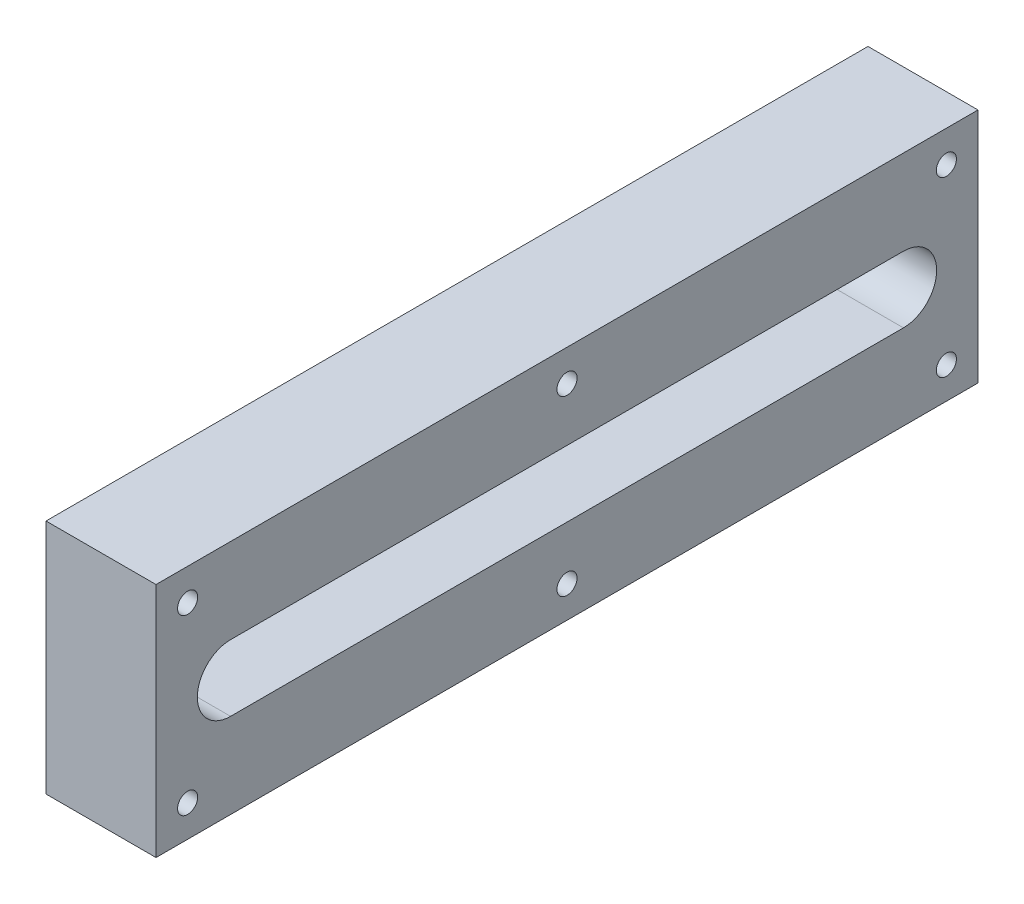
ISO-10303-21;
HEADER;
FILE_DESCRIPTION(('STEP AP214'),'2;1');
FILE_NAME('part.step','',(''),(''),'','','');
FILE_SCHEMA(('AUTOMOTIVE_DESIGN { 1 0 10303 214 1 1 1 1 }'));
ENDSEC;
DATA;
#1=APPLICATION_CONTEXT('core data for automotive mechanical design processes');
#2=APPLICATION_PROTOCOL_DEFINITION('international standard','automotive_design',2000,#1);
#3=PRODUCT_CONTEXT('',#1,'mechanical');
#4=PRODUCT('Part','Part','',(#3));
#5=PRODUCT_RELATED_PRODUCT_CATEGORY('part','',(#4));
#6=PRODUCT_DEFINITION_FORMATION('','',#4);
#7=PRODUCT_DEFINITION_CONTEXT('part definition',#1,'design');
#8=PRODUCT_DEFINITION('design','',#6,#7);
#9=PRODUCT_DEFINITION_SHAPE('','',#8);
#10=(LENGTH_UNIT() NAMED_UNIT(*) SI_UNIT(.MILLI.,.METRE.));
#11=(NAMED_UNIT(*) PLANE_ANGLE_UNIT() SI_UNIT($,.RADIAN.));
#12=(NAMED_UNIT(*) SI_UNIT($,.STERADIAN.) SOLID_ANGLE_UNIT());
#13=UNCERTAINTY_MEASURE_WITH_UNIT(LENGTH_MEASURE(1.E-05),#10,'distance_accuracy_value','');
#14=(GEOMETRIC_REPRESENTATION_CONTEXT(3) GLOBAL_UNCERTAINTY_ASSIGNED_CONTEXT((#13)) GLOBAL_UNIT_ASSIGNED_CONTEXT((#10,
#11,#12)) REPRESENTATION_CONTEXT('',''));
#15=CARTESIAN_POINT('',(0.,0.,0.));
#16=DIRECTION('',(0.,0.,1.));
#17=DIRECTION('',(1.,0.,0.));
#18=AXIS2_PLACEMENT_3D('',#15,#16,#17);
#19=CARTESIAN_POINT('',(22.098,0.,0.));
#20=DIRECTION('',(1.,0.,0.));
#21=DIRECTION('',(0.,0.,-1.));
#22=AXIS2_PLACEMENT_3D('',#19,#20,#21);
#23=PLANE('',#22);
#24=CARTESIAN_POINT('',(22.098,17.399,76.2));
#25=DIRECTION('',(1.,0.,0.));
#26=DIRECTION('',(0.,0.,-1.));
#27=AXIS2_PLACEMENT_3D('',#24,#25,#26);
#28=CIRCLE('',#27,2.0193);
#29=CARTESIAN_POINT('',(22.098,17.399,74.1807));
#30=VERTEX_POINT('',#29);
#31=EDGE_CURVE('E256',#30,#30,#28,.T.);
#32=ORIENTED_EDGE('',*,*,#31,.F.);
#33=EDGE_LOOP('',(#32));
#34=FACE_BOUND('',#33,.T.);
#35=CARTESIAN_POINT('',(22.098,-17.399,76.2));
#36=DIRECTION('',(1.,0.,0.));
#37=DIRECTION('',(0.,0.,-1.));
#38=AXIS2_PLACEMENT_3D('',#35,#36,#37);
#39=CIRCLE('',#38,2.0193);
#40=CARTESIAN_POINT('',(22.098,-17.399,74.1807));
#41=VERTEX_POINT('',#40);
#42=EDGE_CURVE('E258',#41,#41,#39,.T.);
#43=ORIENTED_EDGE('',*,*,#42,.F.);
#44=EDGE_LOOP('',(#43));
#45=FACE_BOUND('',#44,.T.);
#46=CARTESIAN_POINT('',(22.098,-17.399,0.));
#47=DIRECTION('',(1.,0.,0.));
#48=DIRECTION('',(0.,0.,-1.));
#49=AXIS2_PLACEMENT_3D('',#46,#47,#48);
#50=CIRCLE('',#49,2.0193);
#51=CARTESIAN_POINT('',(22.098,-17.399,-2.0193));
#52=VERTEX_POINT('',#51);
#53=EDGE_CURVE('E266',#52,#52,#50,.T.);
#54=ORIENTED_EDGE('',*,*,#53,.F.);
#55=EDGE_LOOP('',(#54));
#56=FACE_BOUND('',#55,.T.);
#57=CARTESIAN_POINT('',(22.098,-17.399,-76.2));
#58=DIRECTION('',(1.,0.,0.));
#59=DIRECTION('',(0.,0.,-1.));
#60=AXIS2_PLACEMENT_3D('',#57,#58,#59);
#61=CIRCLE('',#60,2.0193);
#62=CARTESIAN_POINT('',(22.098,-17.399,-78.2193));
#63=VERTEX_POINT('',#62);
#64=EDGE_CURVE('E272',#63,#63,#61,.T.);
#65=ORIENTED_EDGE('',*,*,#64,.F.);
#66=EDGE_LOOP('',(#65));
#67=FACE_BOUND('',#66,.T.);
#68=CARTESIAN_POINT('',(22.098,17.399,-76.2));
#69=DIRECTION('',(1.,0.,0.));
#70=DIRECTION('',(0.,0.,-1.));
#71=AXIS2_PLACEMENT_3D('',#68,#69,#70);
#72=CIRCLE('',#71,2.0193);
#73=CARTESIAN_POINT('',(22.098,17.399,-78.2193));
#74=VERTEX_POINT('',#73);
#75=EDGE_CURVE('E278',#74,#74,#72,.T.);
#76=ORIENTED_EDGE('',*,*,#75,.F.);
#77=EDGE_LOOP('',(#76));
#78=FACE_BOUND('',#77,.T.);
#79=CARTESIAN_POINT('',(22.098,17.399,0.));
#80=DIRECTION('',(1.,0.,0.));
#81=DIRECTION('',(0.,0.,-1.));
#82=AXIS2_PLACEMENT_3D('',#79,#80,#81);
#83=CIRCLE('',#82,2.0193);
#84=CARTESIAN_POINT('',(22.098,17.399,-2.0193));
#85=VERTEX_POINT('',#84);
#86=EDGE_CURVE('E284',#85,#85,#83,.T.);
#87=ORIENTED_EDGE('',*,*,#86,.F.);
#88=EDGE_LOOP('',(#87));
#89=FACE_BOUND('',#88,.T.);
#90=DIRECTION('',(0.,-1.,0.));
#91=VECTOR('',#90,1.);
#92=CARTESIAN_POINT('',(22.098,-23.749,82.55));
#93=LINE('',#92,#91);
#94=CARTESIAN_POINT('',(22.098,23.749,82.55));
#95=VERTEX_POINT('',#94);
#96=CARTESIAN_POINT('',(22.098,-23.749,82.55));
#97=VERTEX_POINT('',#96);
#98=EDGE_CURVE('E146',#95,#97,#93,.T.);
#99=ORIENTED_EDGE('',*,*,#98,.T.);
#100=DIRECTION('',(0.,0.,-1.));
#101=VECTOR('',#100,1.);
#102=CARTESIAN_POINT('',(22.098,-23.749,-82.55));
#103=LINE('',#102,#101);
#104=CARTESIAN_POINT('',(22.098,-23.749,-82.55));
#105=VERTEX_POINT('',#104);
#106=EDGE_CURVE('E149',#97,#105,#103,.T.);
#107=ORIENTED_EDGE('',*,*,#106,.T.);
#108=DIRECTION('',(0.,1.,0.));
#109=VECTOR('',#108,1.);
#110=CARTESIAN_POINT('',(22.098,-23.749,-82.55));
#111=LINE('',#110,#109);
#112=CARTESIAN_POINT('',(22.098,23.749,-82.55));
#113=VERTEX_POINT('',#112);
#114=EDGE_CURVE('E152',#105,#113,#111,.T.);
#115=ORIENTED_EDGE('',*,*,#114,.T.);
#116=DIRECTION('',(0.,0.,1.));
#117=VECTOR('',#116,1.);
#118=CARTESIAN_POINT('',(22.098,23.749,-82.55));
#119=LINE('',#118,#117);
#120=EDGE_CURVE('E154',#113,#95,#119,.T.);
#121=ORIENTED_EDGE('',*,*,#120,.T.);
#122=EDGE_LOOP('',(#99,#107,#115,#121));
#123=FACE_BOUND('',#122,.T.);
#124=DIRECTION('',(0.,0.,-1.));
#125=VECTOR('',#124,1.);
#126=CARTESIAN_POINT('',(22.098,-6.66750000000002,67.5752522));
#127=LINE('',#126,#125);
#128=CARTESIAN_POINT('',(22.098,-6.66750000000002,67.5752522));
#129=VERTEX_POINT('',#128);
#130=CARTESIAN_POINT('',(22.098,-6.6675,-67.5752522));
#131=VERTEX_POINT('',#130);
#132=EDGE_CURVE('E116',#129,#131,#127,.T.);
#133=ORIENTED_EDGE('',*,*,#132,.F.);
#134=CARTESIAN_POINT('',(22.098,0.,67.5752522));
#135=DIRECTION('',(1.,0.,0.));
#136=DIRECTION('',(0.,0.,-1.));
#137=AXIS2_PLACEMENT_3D('',#134,#135,#136);
#138=CIRCLE('',#137,6.66750000000002);
#139=CARTESIAN_POINT('',(22.098,6.66750000000002,67.5752522));
#140=VERTEX_POINT('',#139);
#141=EDGE_CURVE('E108',#140,#129,#138,.T.);
#142=ORIENTED_EDGE('',*,*,#141,.F.);
#143=DIRECTION('',(0.,0.,1.));
#144=VECTOR('',#143,1.);
#145=CARTESIAN_POINT('',(22.098,6.66750000000002,67.5752522));
#146=LINE('',#145,#144);
#147=CARTESIAN_POINT('',(22.098,6.66750000000005,-67.5752522));
#148=VERTEX_POINT('',#147);
#149=EDGE_CURVE('E130',#148,#140,#146,.T.);
#150=ORIENTED_EDGE('',*,*,#149,.F.);
#151=CARTESIAN_POINT('',(22.098,0.,-67.5752522));
#152=DIRECTION('',(1.,0.,0.));
#153=DIRECTION('',(0.,0.,-1.));
#154=AXIS2_PLACEMENT_3D('',#151,#152,#153);
#155=CIRCLE('',#154,6.66750000000002);
#156=EDGE_CURVE('E128',#131,#148,#155,.T.);
#157=ORIENTED_EDGE('',*,*,#156,.F.);
#158=EDGE_LOOP('',(#133,#142,#150,#157));
#159=FACE_BOUND('',#158,.T.);
#160=ADVANCED_FACE('F43',(#34,#45,#56,#67,#78,#89,#123,#159),#23,.T.);
#161=CARTESIAN_POINT('',(0.,0.,0.));
#162=DIRECTION('',(1.,0.,0.));
#163=DIRECTION('',(0.,0.,-1.));
#164=AXIS2_PLACEMENT_3D('',#161,#162,#163);
#165=PLANE('',#164);
#166=CARTESIAN_POINT('',(0.,17.399,76.2));
#167=DIRECTION('',(1.,0.,0.));
#168=DIRECTION('',(0.,0.,-1.));
#169=AXIS2_PLACEMENT_3D('',#166,#167,#168);
#170=CIRCLE('',#169,2.01929999999999);
#171=CARTESIAN_POINT('',(0.,17.399,74.1807));
#172=VERTEX_POINT('',#171);
#173=EDGE_CURVE('E254',#172,#172,#170,.T.);
#174=ORIENTED_EDGE('',*,*,#173,.T.);
#175=EDGE_LOOP('',(#174));
#176=FACE_BOUND('',#175,.T.);
#177=CARTESIAN_POINT('',(0.,-17.399,76.2));
#178=DIRECTION('',(1.,0.,0.));
#179=DIRECTION('',(0.,0.,-1.));
#180=AXIS2_PLACEMENT_3D('',#177,#178,#179);
#181=CIRCLE('',#180,2.01929999999999);
#182=CARTESIAN_POINT('',(0.,-17.399,74.1807));
#183=VERTEX_POINT('',#182);
#184=EDGE_CURVE('E263',#183,#183,#181,.T.);
#185=ORIENTED_EDGE('',*,*,#184,.T.);
#186=EDGE_LOOP('',(#185));
#187=FACE_BOUND('',#186,.T.);
#188=CARTESIAN_POINT('',(0.,-17.399,0.));
#189=DIRECTION('',(1.,0.,0.));
#190=DIRECTION('',(0.,0.,-1.));
#191=AXIS2_PLACEMENT_3D('',#188,#189,#190);
#192=CIRCLE('',#191,2.01929999999999);
#193=CARTESIAN_POINT('',(0.,-17.399,-2.01929999999999));
#194=VERTEX_POINT('',#193);
#195=EDGE_CURVE('E269',#194,#194,#192,.T.);
#196=ORIENTED_EDGE('',*,*,#195,.T.);
#197=EDGE_LOOP('',(#196));
#198=FACE_BOUND('',#197,.T.);
#199=CARTESIAN_POINT('',(0.,-17.399,-76.2));
#200=DIRECTION('',(1.,0.,0.));
#201=DIRECTION('',(0.,0.,-1.));
#202=AXIS2_PLACEMENT_3D('',#199,#200,#201);
#203=CIRCLE('',#202,2.01929999999999);
#204=CARTESIAN_POINT('',(0.,-17.399,-78.2193));
#205=VERTEX_POINT('',#204);
#206=EDGE_CURVE('E275',#205,#205,#203,.T.);
#207=ORIENTED_EDGE('',*,*,#206,.T.);
#208=EDGE_LOOP('',(#207));
#209=FACE_BOUND('',#208,.T.);
#210=CARTESIAN_POINT('',(0.,17.399,-76.2));
#211=DIRECTION('',(1.,0.,0.));
#212=DIRECTION('',(0.,0.,-1.));
#213=AXIS2_PLACEMENT_3D('',#210,#211,#212);
#214=CIRCLE('',#213,2.01929999999999);
#215=CARTESIAN_POINT('',(0.,17.399,-78.2193));
#216=VERTEX_POINT('',#215);
#217=EDGE_CURVE('E281',#216,#216,#214,.T.);
#218=ORIENTED_EDGE('',*,*,#217,.T.);
#219=EDGE_LOOP('',(#218));
#220=FACE_BOUND('',#219,.T.);
#221=CARTESIAN_POINT('',(0.,17.399,0.));
#222=DIRECTION('',(1.,0.,0.));
#223=DIRECTION('',(0.,0.,-1.));
#224=AXIS2_PLACEMENT_3D('',#221,#222,#223);
#225=CIRCLE('',#224,2.01929999999999);
#226=CARTESIAN_POINT('',(0.,17.399,-2.01929999999999));
#227=VERTEX_POINT('',#226);
#228=EDGE_CURVE('E136',#227,#227,#225,.T.);
#229=ORIENTED_EDGE('',*,*,#228,.T.);
#230=EDGE_LOOP('',(#229));
#231=FACE_BOUND('',#230,.T.);
#232=DIRECTION('',(0.,-1.,0.));
#233=VECTOR('',#232,1.);
#234=CARTESIAN_POINT('',(0.,-23.749,82.55));
#235=LINE('',#234,#233);
#236=CARTESIAN_POINT('',(0.,23.749,82.55));
#237=VERTEX_POINT('',#236);
#238=CARTESIAN_POINT('',(0.,-23.749,82.55));
#239=VERTEX_POINT('',#238);
#240=EDGE_CURVE('E124',#237,#239,#235,.T.);
#241=ORIENTED_EDGE('',*,*,#240,.F.);
#242=DIRECTION('',(0.,0.,1.));
#243=VECTOR('',#242,1.);
#244=CARTESIAN_POINT('',(0.,23.749,-82.55));
#245=LINE('',#244,#243);
#246=CARTESIAN_POINT('',(0.,23.749,-82.55));
#247=VERTEX_POINT('',#246);
#248=EDGE_CURVE('E150',#247,#237,#245,.T.);
#249=ORIENTED_EDGE('',*,*,#248,.F.);
#250=DIRECTION('',(0.,1.,0.));
#251=VECTOR('',#250,1.);
#252=CARTESIAN_POINT('',(0.,-23.749,-82.55));
#253=LINE('',#252,#251);
#254=CARTESIAN_POINT('',(0.,-23.749,-82.55));
#255=VERTEX_POINT('',#254);
#256=EDGE_CURVE('E161',#255,#247,#253,.T.);
#257=ORIENTED_EDGE('',*,*,#256,.F.);
#258=DIRECTION('',(0.,0.,-1.));
#259=VECTOR('',#258,1.);
#260=CARTESIAN_POINT('',(0.,-23.749,-82.55));
#261=LINE('',#260,#259);
#262=EDGE_CURVE('E159',#239,#255,#261,.T.);
#263=ORIENTED_EDGE('',*,*,#262,.F.);
#264=EDGE_LOOP('',(#241,#249,#257,#263));
#265=FACE_BOUND('',#264,.T.);
#266=CARTESIAN_POINT('',(0.,0.,67.5752522));
#267=DIRECTION('',(1.,0.,0.));
#268=DIRECTION('',(0.,0.,-1.));
#269=AXIS2_PLACEMENT_3D('',#266,#267,#268);
#270=CIRCLE('',#269,6.66750000000002);
#271=CARTESIAN_POINT('',(0.,6.66750000000002,67.5752522));
#272=VERTEX_POINT('',#271);
#273=CARTESIAN_POINT('',(0.,-6.66750000000002,67.5752522));
#274=VERTEX_POINT('',#273);
#275=EDGE_CURVE('E66',#272,#274,#270,.T.);
#276=ORIENTED_EDGE('',*,*,#275,.T.);
#277=DIRECTION('',(0.,0.,-1.));
#278=VECTOR('',#277,1.);
#279=CARTESIAN_POINT('',(0.,-6.66750000000002,67.5752522));
#280=LINE('',#279,#278);
#281=CARTESIAN_POINT('',(0.,-6.6675,-67.5752522));
#282=VERTEX_POINT('',#281);
#283=EDGE_CURVE('E123',#274,#282,#280,.T.);
#284=ORIENTED_EDGE('',*,*,#283,.T.);
#285=CARTESIAN_POINT('',(0.,0.,-67.5752522));
#286=DIRECTION('',(1.,0.,0.));
#287=DIRECTION('',(0.,0.,-1.));
#288=AXIS2_PLACEMENT_3D('',#285,#286,#287);
#289=CIRCLE('',#288,6.66750000000002);
#290=CARTESIAN_POINT('',(0.,6.66750000000005,-67.5752522));
#291=VERTEX_POINT('',#290);
#292=EDGE_CURVE('E138',#282,#291,#289,.T.);
#293=ORIENTED_EDGE('',*,*,#292,.T.);
#294=DIRECTION('',(0.,0.,1.));
#295=VECTOR('',#294,1.);
#296=CARTESIAN_POINT('',(0.,6.66750000000002,67.5752522));
#297=LINE('',#296,#295);
#298=EDGE_CURVE('E117',#291,#272,#297,.T.);
#299=ORIENTED_EDGE('',*,*,#298,.T.);
#300=EDGE_LOOP('',(#276,#284,#293,#299));
#301=FACE_BOUND('',#300,.T.);
#302=ADVANCED_FACE('F179',(#176,#187,#198,#209,#220,#231,#265,#301),#165,.F.);
#303=CARTESIAN_POINT('',(22.098,-23.749,82.55));
#304=DIRECTION('',(0.,0.,-1.));
#305=DIRECTION('',(-1.,0.,0.));
#306=AXIS2_PLACEMENT_3D('',#303,#304,#305);
#307=PLANE('',#306);
#308=ORIENTED_EDGE('',*,*,#240,.T.);
#309=DIRECTION('',(-1.,0.,0.));
#310=VECTOR('',#309,1.);
#311=CARTESIAN_POINT('',(22.098,-23.749,82.55));
#312=LINE('',#311,#310);
#313=EDGE_CURVE('E11',#97,#239,#312,.T.);
#314=ORIENTED_EDGE('',*,*,#313,.F.);
#315=ORIENTED_EDGE('',*,*,#98,.F.);
#316=DIRECTION('',(-1.,0.,0.));
#317=VECTOR('',#316,1.);
#318=CARTESIAN_POINT('',(22.098,23.749,82.55));
#319=LINE('',#318,#317);
#320=EDGE_CURVE('E156',#95,#237,#319,.T.);
#321=ORIENTED_EDGE('',*,*,#320,.T.);
#322=EDGE_LOOP('',(#308,#314,#315,#321));
#323=FACE_BOUND('',#322,.T.);
#324=ADVANCED_FACE('F45',(#323),#307,.F.);
#325=CARTESIAN_POINT('',(22.098,-23.749,-82.55));
#326=DIRECTION('',(0.,1.,0.));
#327=DIRECTION('',(0.,0.,1.));
#328=AXIS2_PLACEMENT_3D('',#325,#326,#327);
#329=PLANE('',#328);
#330=ORIENTED_EDGE('',*,*,#262,.T.);
#331=DIRECTION('',(-1.,0.,0.));
#332=VECTOR('',#331,1.);
#333=CARTESIAN_POINT('',(22.098,-23.749,-82.55));
#334=LINE('',#333,#332);
#335=EDGE_CURVE('E51',#105,#255,#334,.T.);
#336=ORIENTED_EDGE('',*,*,#335,.F.);
#337=ORIENTED_EDGE('',*,*,#106,.F.);
#338=ORIENTED_EDGE('',*,*,#313,.T.);
#339=EDGE_LOOP('',(#330,#336,#337,#338));
#340=FACE_BOUND('',#339,.T.);
#341=ADVANCED_FACE('F189',(#340),#329,.F.);
#342=CARTESIAN_POINT('',(22.098,-23.749,-82.55));
#343=DIRECTION('',(0.,0.,1.));
#344=DIRECTION('',(0.,-1.,0.));
#345=AXIS2_PLACEMENT_3D('',#342,#343,#344);
#346=PLANE('',#345);
#347=ORIENTED_EDGE('',*,*,#256,.T.);
#348=DIRECTION('',(-1.,0.,0.));
#349=VECTOR('',#348,1.);
#350=CARTESIAN_POINT('',(22.098,23.749,-82.55));
#351=LINE('',#350,#349);
#352=EDGE_CURVE('E166',#113,#247,#351,.T.);
#353=ORIENTED_EDGE('',*,*,#352,.F.);
#354=ORIENTED_EDGE('',*,*,#114,.F.);
#355=ORIENTED_EDGE('',*,*,#335,.T.);
#356=EDGE_LOOP('',(#347,#353,#354,#355));
#357=FACE_BOUND('',#356,.T.);
#358=ADVANCED_FACE('F173',(#357),#346,.F.);
#359=CARTESIAN_POINT('',(22.098,23.749,-82.55));
#360=DIRECTION('',(0.,-1.,0.));
#361=DIRECTION('',(0.,0.,-1.));
#362=AXIS2_PLACEMENT_3D('',#359,#360,#361);
#363=PLANE('',#362);
#364=ORIENTED_EDGE('',*,*,#248,.T.);
#365=ORIENTED_EDGE('',*,*,#320,.F.);
#366=ORIENTED_EDGE('',*,*,#120,.F.);
#367=ORIENTED_EDGE('',*,*,#352,.T.);
#368=EDGE_LOOP('',(#364,#365,#366,#367));
#369=FACE_BOUND('',#368,.T.);
#370=ADVANCED_FACE('F183',(#369),#363,.F.);
#371=CARTESIAN_POINT('',(22.098,0.,67.5752522));
#372=DIRECTION('',(-1.,0.,0.));
#373=DIRECTION('',(0.,0.,1.));
#374=AXIS2_PLACEMENT_3D('',#371,#372,#373);
#375=CYLINDRICAL_SURFACE('',#374,6.66750000000002);
#376=ORIENTED_EDGE('',*,*,#275,.F.);
#377=DIRECTION('',(-1.,0.,0.));
#378=VECTOR('',#377,1.);
#379=CARTESIAN_POINT('',(22.098,6.66750000000002,67.5752522));
#380=LINE('',#379,#378);
#381=EDGE_CURVE('E112',#140,#272,#380,.T.);
#382=ORIENTED_EDGE('',*,*,#381,.F.);
#383=ORIENTED_EDGE('',*,*,#141,.T.);
#384=DIRECTION('',(-1.,0.,0.));
#385=VECTOR('',#384,1.);
#386=CARTESIAN_POINT('',(22.098,-6.66750000000002,67.5752522));
#387=LINE('',#386,#385);
#388=EDGE_CURVE('E111',#129,#274,#387,.T.);
#389=ORIENTED_EDGE('',*,*,#388,.T.);
#390=EDGE_LOOP('',(#376,#382,#383,#389));
#391=FACE_BOUND('',#390,.T.);
#392=ADVANCED_FACE('F110',(#391),#375,.F.);
#393=CARTESIAN_POINT('',(22.098,-6.66750000000002,67.5752522));
#394=DIRECTION('',(0.,1.,0.));
#395=DIRECTION('',(0.,0.,1.));
#396=AXIS2_PLACEMENT_3D('',#393,#394,#395);
#397=PLANE('',#396);
#398=ORIENTED_EDGE('',*,*,#283,.F.);
#399=ORIENTED_EDGE('',*,*,#388,.F.);
#400=ORIENTED_EDGE('',*,*,#132,.T.);
#401=DIRECTION('',(-1.,0.,0.));
#402=VECTOR('',#401,1.);
#403=CARTESIAN_POINT('',(22.098,-6.6675,-67.5752522));
#404=LINE('',#403,#402);
#405=EDGE_CURVE('E125',#131,#282,#404,.T.);
#406=ORIENTED_EDGE('',*,*,#405,.T.);
#407=EDGE_LOOP('',(#398,#399,#400,#406));
#408=FACE_BOUND('',#407,.T.);
#409=ADVANCED_FACE('F120',(#408),#397,.T.);
#410=CARTESIAN_POINT('',(22.098,0.,-67.5752522));
#411=DIRECTION('',(-1.,0.,0.));
#412=DIRECTION('',(0.,0.,1.));
#413=AXIS2_PLACEMENT_3D('',#410,#411,#412);
#414=CYLINDRICAL_SURFACE('',#413,6.66750000000002);
#415=ORIENTED_EDGE('',*,*,#292,.F.);
#416=ORIENTED_EDGE('',*,*,#405,.F.);
#417=ORIENTED_EDGE('',*,*,#156,.T.);
#418=DIRECTION('',(-1.,0.,0.));
#419=VECTOR('',#418,1.);
#420=CARTESIAN_POINT('',(22.098,6.66750000000005,-67.5752522));
#421=LINE('',#420,#419);
#422=EDGE_CURVE('E58',#148,#291,#421,.T.);
#423=ORIENTED_EDGE('',*,*,#422,.T.);
#424=EDGE_LOOP('',(#415,#416,#417,#423));
#425=FACE_BOUND('',#424,.T.);
#426=ADVANCED_FACE('F216',(#425),#414,.F.);
#427=CARTESIAN_POINT('',(22.098,6.66750000000002,67.5752522));
#428=DIRECTION('',(0.,-1.,0.));
#429=DIRECTION('',(0.,0.,-1.));
#430=AXIS2_PLACEMENT_3D('',#427,#428,#429);
#431=PLANE('',#430);
#432=ORIENTED_EDGE('',*,*,#298,.F.);
#433=ORIENTED_EDGE('',*,*,#422,.F.);
#434=ORIENTED_EDGE('',*,*,#149,.T.);
#435=ORIENTED_EDGE('',*,*,#381,.T.);
#436=EDGE_LOOP('',(#432,#433,#434,#435));
#437=FACE_BOUND('',#436,.T.);
#438=ADVANCED_FACE('F220',(#437),#431,.T.);
#439=CARTESIAN_POINT('',(22.098,17.399,0.));
#440=DIRECTION('',(1.,0.,0.));
#441=DIRECTION('',(0.,0.,-1.));
#442=AXIS2_PLACEMENT_3D('',#439,#440,#441);
#443=CYLINDRICAL_SURFACE('',#442,2.0193);
#444=ORIENTED_EDGE('',*,*,#228,.F.);
#445=EDGE_LOOP('',(#444));
#446=FACE_BOUND('',#445,.T.);
#447=ORIENTED_EDGE('',*,*,#86,.T.);
#448=EDGE_LOOP('',(#447));
#449=FACE_BOUND('',#448,.T.);
#450=ADVANCED_FACE('F226',(#446,#449),#443,.F.);
#451=CARTESIAN_POINT('',(22.098,17.399,-76.2));
#452=DIRECTION('',(1.,0.,0.));
#453=DIRECTION('',(0.,0.,-1.));
#454=AXIS2_PLACEMENT_3D('',#451,#452,#453);
#455=CYLINDRICAL_SURFACE('',#454,2.0193);
#456=ORIENTED_EDGE('',*,*,#217,.F.);
#457=EDGE_LOOP('',(#456));
#458=FACE_BOUND('',#457,.T.);
#459=ORIENTED_EDGE('',*,*,#75,.T.);
#460=EDGE_LOOP('',(#459));
#461=FACE_BOUND('',#460,.T.);
#462=ADVANCED_FACE('F229',(#458,#461),#455,.F.);
#463=CARTESIAN_POINT('',(22.098,-17.399,-76.2));
#464=DIRECTION('',(1.,0.,0.));
#465=DIRECTION('',(0.,0.,-1.));
#466=AXIS2_PLACEMENT_3D('',#463,#464,#465);
#467=CYLINDRICAL_SURFACE('',#466,2.0193);
#468=ORIENTED_EDGE('',*,*,#206,.F.);
#469=EDGE_LOOP('',(#468));
#470=FACE_BOUND('',#469,.T.);
#471=ORIENTED_EDGE('',*,*,#64,.T.);
#472=EDGE_LOOP('',(#471));
#473=FACE_BOUND('',#472,.T.);
#474=ADVANCED_FACE('F233',(#470,#473),#467,.F.);
#475=CARTESIAN_POINT('',(22.098,-17.399,0.));
#476=DIRECTION('',(1.,0.,0.));
#477=DIRECTION('',(0.,0.,-1.));
#478=AXIS2_PLACEMENT_3D('',#475,#476,#477);
#479=CYLINDRICAL_SURFACE('',#478,2.0193);
#480=ORIENTED_EDGE('',*,*,#195,.F.);
#481=EDGE_LOOP('',(#480));
#482=FACE_BOUND('',#481,.T.);
#483=ORIENTED_EDGE('',*,*,#53,.T.);
#484=EDGE_LOOP('',(#483));
#485=FACE_BOUND('',#484,.T.);
#486=ADVANCED_FACE('F237',(#482,#485),#479,.F.);
#487=CARTESIAN_POINT('',(22.098,-17.399,76.2));
#488=DIRECTION('',(1.,0.,0.));
#489=DIRECTION('',(0.,0.,-1.));
#490=AXIS2_PLACEMENT_3D('',#487,#488,#489);
#491=CYLINDRICAL_SURFACE('',#490,2.0193);
#492=ORIENTED_EDGE('',*,*,#184,.F.);
#493=EDGE_LOOP('',(#492));
#494=FACE_BOUND('',#493,.T.);
#495=ORIENTED_EDGE('',*,*,#42,.T.);
#496=EDGE_LOOP('',(#495));
#497=FACE_BOUND('',#496,.T.);
#498=ADVANCED_FACE('F241',(#494,#497),#491,.F.);
#499=CARTESIAN_POINT('',(22.098,17.399,76.2));
#500=DIRECTION('',(1.,0.,0.));
#501=DIRECTION('',(0.,0.,-1.));
#502=AXIS2_PLACEMENT_3D('',#499,#500,#501);
#503=CYLINDRICAL_SURFACE('',#502,2.0193);
#504=ORIENTED_EDGE('',*,*,#173,.F.);
#505=EDGE_LOOP('',(#504));
#506=FACE_BOUND('',#505,.T.);
#507=ORIENTED_EDGE('',*,*,#31,.T.);
#508=EDGE_LOOP('',(#507));
#509=FACE_BOUND('',#508,.T.);
#510=ADVANCED_FACE('F245',(#506,#509),#503,.F.);
#511=CLOSED_SHELL('',(#160,#302,#324,#341,#358,#370,#392,#409,#426,#438,#450,#462,#474,#486,
#498,#510));
#512=MANIFOLD_SOLID_BREP('B2',#511);
#513=ADVANCED_BREP_SHAPE_REPRESENTATION('',(#18,#512),#14);
#514=SHAPE_DEFINITION_REPRESENTATION(#9,#513);
ENDSEC;
END-ISO-10303-21;
